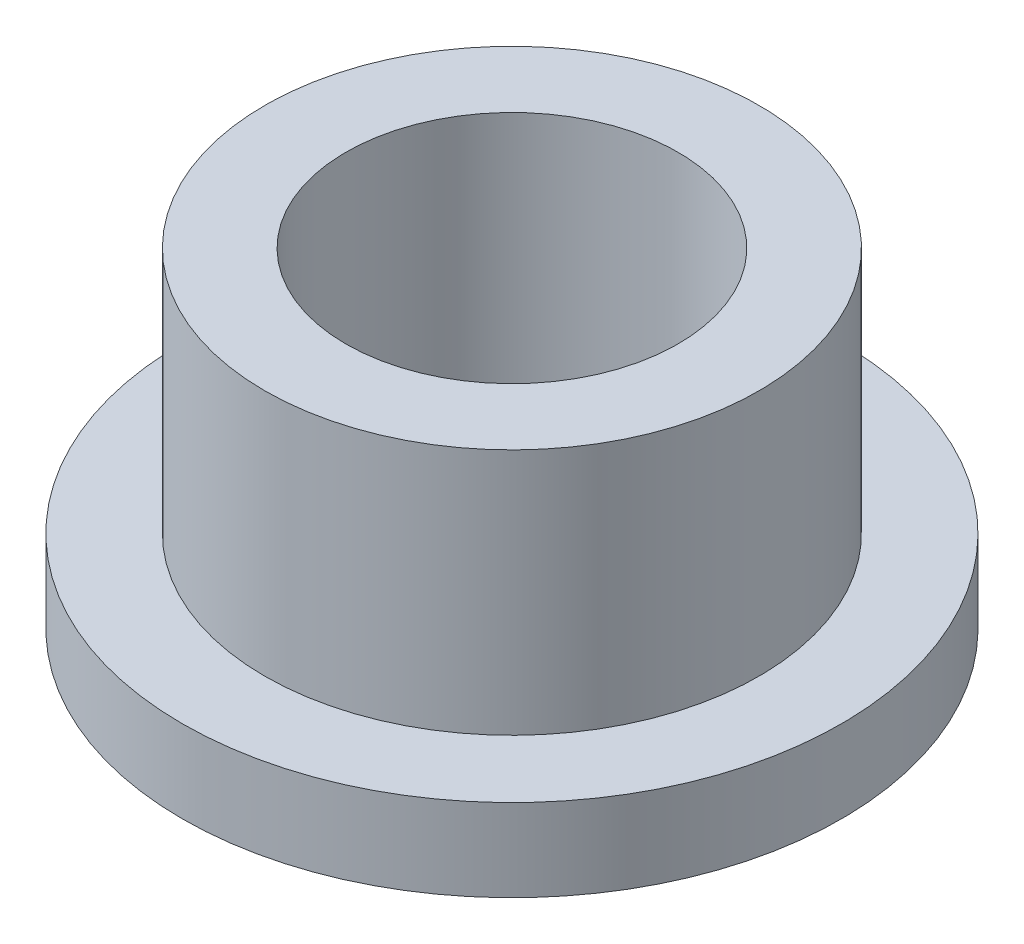
ISO-10303-21;
HEADER;
FILE_DESCRIPTION(('STEP AP214'),'2;1');
FILE_NAME('part.step','',(''),(''),'','','');
FILE_SCHEMA(('AUTOMOTIVE_DESIGN { 1 0 10303 214 1 1 1 1 }'));
ENDSEC;
DATA;
#1=APPLICATION_CONTEXT('core data for automotive mechanical design processes');
#2=APPLICATION_PROTOCOL_DEFINITION('international standard','automotive_design',2000,#1);
#3=PRODUCT_CONTEXT('',#1,'mechanical');
#4=PRODUCT('Part','Part','',(#3));
#5=PRODUCT_RELATED_PRODUCT_CATEGORY('part','',(#4));
#6=PRODUCT_DEFINITION_FORMATION('','',#4);
#7=PRODUCT_DEFINITION_CONTEXT('part definition',#1,'design');
#8=PRODUCT_DEFINITION('design','',#6,#7);
#9=PRODUCT_DEFINITION_SHAPE('','',#8);
#10=(LENGTH_UNIT() NAMED_UNIT(*) SI_UNIT(.MILLI.,.METRE.));
#11=(NAMED_UNIT(*) PLANE_ANGLE_UNIT() SI_UNIT($,.RADIAN.));
#12=(NAMED_UNIT(*) SI_UNIT($,.STERADIAN.) SOLID_ANGLE_UNIT());
#13=UNCERTAINTY_MEASURE_WITH_UNIT(LENGTH_MEASURE(1.E-05),#10,'distance_accuracy_value','');
#14=(GEOMETRIC_REPRESENTATION_CONTEXT(3) GLOBAL_UNCERTAINTY_ASSIGNED_CONTEXT((#13)) GLOBAL_UNIT_ASSIGNED_CONTEXT((#10,
#11,#12)) REPRESENTATION_CONTEXT('',''));
#15=CARTESIAN_POINT('',(0.,0.,0.));
#16=DIRECTION('',(0.,0.,1.));
#17=DIRECTION('',(1.,0.,0.));
#18=AXIS2_PLACEMENT_3D('',#15,#16,#17);
#19=CARTESIAN_POINT('',(0.,6.35,0.));
#20=DIRECTION('',(0.,1.,0.));
#21=DIRECTION('',(0.,0.,1.));
#22=AXIS2_PLACEMENT_3D('',#19,#20,#21);
#23=PLANE('',#22);
#24=CARTESIAN_POINT('',(0.,6.35,0.));
#25=DIRECTION('',(0.,1.,0.));
#26=DIRECTION('',(0.,0.,1.));
#27=AXIS2_PLACEMENT_3D('',#24,#25,#26);
#28=CIRCLE('',#27,4.7625);
#29=CARTESIAN_POINT('',(0.,6.35,4.7625));
#30=VERTEX_POINT('',#29);
#31=EDGE_CURVE('E10',#30,#30,#28,.T.);
#32=ORIENTED_EDGE('',*,*,#31,.T.);
#33=EDGE_LOOP('',(#32));
#34=FACE_BOUND('',#33,.T.);
#35=CARTESIAN_POINT('',(0.,6.35,0.));
#36=DIRECTION('',(0.,1.,0.));
#37=DIRECTION('',(0.,0.,1.));
#38=AXIS2_PLACEMENT_3D('',#35,#36,#37);
#39=CIRCLE('',#38,3.2004);
#40=CARTESIAN_POINT('',(0.,6.35,3.2004));
#41=VERTEX_POINT('',#40);
#42=EDGE_CURVE('E37',#41,#41,#39,.T.);
#43=ORIENTED_EDGE('',*,*,#42,.F.);
#44=EDGE_LOOP('',(#43));
#45=FACE_BOUND('',#44,.T.);
#46=ADVANCED_FACE('F30',(#34,#45),#23,.T.);
#47=CARTESIAN_POINT('',(0.,0.,0.));
#48=DIRECTION('',(0.,1.,0.));
#49=DIRECTION('',(0.,0.,1.));
#50=AXIS2_PLACEMENT_3D('',#47,#48,#49);
#51=PLANE('',#50);
#52=CARTESIAN_POINT('',(0.,0.,0.));
#53=DIRECTION('',(0.,1.,0.));
#54=DIRECTION('',(0.,0.,1.));
#55=AXIS2_PLACEMENT_3D('',#52,#53,#54);
#56=CIRCLE('',#55,3.2004);
#57=CARTESIAN_POINT('',(0.,0.,3.2004));
#58=VERTEX_POINT('',#57);
#59=EDGE_CURVE('E41',#58,#58,#56,.T.);
#60=ORIENTED_EDGE('',*,*,#59,.T.);
#61=EDGE_LOOP('',(#60));
#62=FACE_BOUND('',#61,.T.);
#63=CARTESIAN_POINT('',(0.,0.,0.));
#64=DIRECTION('',(0.,1.,0.));
#65=DIRECTION('',(0.,0.,1.));
#66=AXIS2_PLACEMENT_3D('',#63,#64,#65);
#67=CIRCLE('',#66,6.35);
#68=CARTESIAN_POINT('',(0.,0.,6.35));
#69=VERTEX_POINT('',#68);
#70=EDGE_CURVE('E48',#69,#69,#67,.T.);
#71=ORIENTED_EDGE('',*,*,#70,.F.);
#72=EDGE_LOOP('',(#71));
#73=FACE_BOUND('',#72,.T.);
#74=ADVANCED_FACE('F73',(#62,#73),#51,.F.);
#75=CARTESIAN_POINT('',(0.,6.35,0.));
#76=DIRECTION('',(0.,-1.,0.));
#77=DIRECTION('',(0.,0.,-1.));
#78=AXIS2_PLACEMENT_3D('',#75,#76,#77);
#79=CYLINDRICAL_SURFACE('',#78,4.7625);
#80=CARTESIAN_POINT('',(0.,1.5875,0.));
#81=DIRECTION('',(0.,1.,0.));
#82=DIRECTION('',(0.,0.,1.));
#83=AXIS2_PLACEMENT_3D('',#80,#81,#82);
#84=CIRCLE('',#83,4.7625);
#85=CARTESIAN_POINT('',(0.,1.5875,4.7625));
#86=VERTEX_POINT('',#85);
#87=EDGE_CURVE('E51',#86,#86,#84,.T.);
#88=ORIENTED_EDGE('',*,*,#87,.T.);
#89=EDGE_LOOP('',(#88));
#90=FACE_BOUND('',#89,.T.);
#91=ORIENTED_EDGE('',*,*,#31,.F.);
#92=EDGE_LOOP('',(#91));
#93=FACE_BOUND('',#92,.T.);
#94=ADVANCED_FACE('F32',(#90,#93),#79,.T.);
#95=CARTESIAN_POINT('',(0.,6.35,0.));
#96=DIRECTION('',(0.,-1.,0.));
#97=DIRECTION('',(0.,0.,-1.));
#98=AXIS2_PLACEMENT_3D('',#95,#96,#97);
#99=CYLINDRICAL_SURFACE('',#98,3.2004);
#100=ORIENTED_EDGE('',*,*,#42,.T.);
#101=EDGE_LOOP('',(#100));
#102=FACE_BOUND('',#101,.T.);
#103=ORIENTED_EDGE('',*,*,#59,.F.);
#104=EDGE_LOOP('',(#103));
#105=FACE_BOUND('',#104,.T.);
#106=ADVANCED_FACE('F62',(#102,#105),#99,.F.);
#107=CARTESIAN_POINT('',(0.,1.5875,0.));
#108=DIRECTION('',(0.,1.,0.));
#109=DIRECTION('',(0.,0.,1.));
#110=AXIS2_PLACEMENT_3D('',#107,#108,#109);
#111=PLANE('',#110);
#112=CARTESIAN_POINT('',(0.,1.5875,0.));
#113=DIRECTION('',(0.,1.,0.));
#114=DIRECTION('',(0.,0.,1.));
#115=AXIS2_PLACEMENT_3D('',#112,#113,#114);
#116=CIRCLE('',#115,6.35);
#117=CARTESIAN_POINT('',(0.,1.5875,6.35));
#118=VERTEX_POINT('',#117);
#119=EDGE_CURVE('E46',#118,#118,#116,.T.);
#120=ORIENTED_EDGE('',*,*,#119,.T.);
#121=EDGE_LOOP('',(#120));
#122=FACE_BOUND('',#121,.T.);
#123=ORIENTED_EDGE('',*,*,#87,.F.);
#124=EDGE_LOOP('',(#123));
#125=FACE_BOUND('',#124,.T.);
#126=ADVANCED_FACE('F59',(#122,#125),#111,.T.);
#127=CARTESIAN_POINT('',(0.,1.5875,0.));
#128=DIRECTION('',(0.,-1.,0.));
#129=DIRECTION('',(0.,0.,-1.));
#130=AXIS2_PLACEMENT_3D('',#127,#128,#129);
#131=CYLINDRICAL_SURFACE('',#130,6.35);
#132=ORIENTED_EDGE('',*,*,#119,.F.);
#133=EDGE_LOOP('',(#132));
#134=FACE_BOUND('',#133,.T.);
#135=ORIENTED_EDGE('',*,*,#70,.T.);
#136=EDGE_LOOP('',(#135));
#137=FACE_BOUND('',#136,.T.);
#138=ADVANCED_FACE('F61',(#134,#137),#131,.T.);
#139=CLOSED_SHELL('',(#46,#74,#94,#106,#126,#138));
#140=MANIFOLD_SOLID_BREP('B2',#139);
#141=ADVANCED_BREP_SHAPE_REPRESENTATION('',(#18,#140),#14);
#142=SHAPE_DEFINITION_REPRESENTATION(#9,#141);
ENDSEC;
END-ISO-10303-21;
